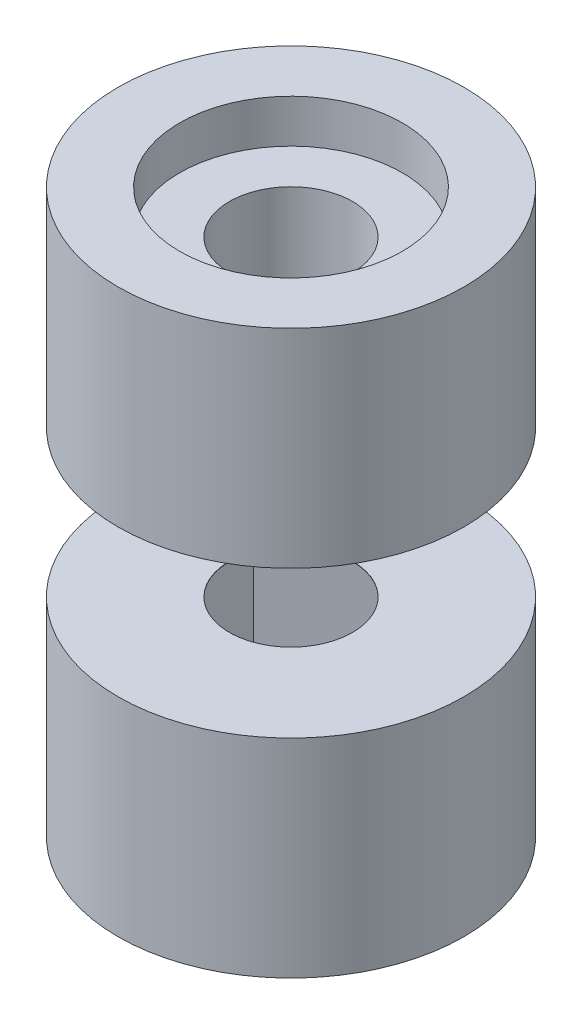
ISO-10303-21;
HEADER;
FILE_DESCRIPTION(('STEP AP214'),'2;1');
FILE_NAME('part.step','',(''),(''),'','','');
FILE_SCHEMA(('AUTOMOTIVE_DESIGN { 1 0 10303 214 1 1 1 1 }'));
ENDSEC;
DATA;
#1=APPLICATION_CONTEXT('core data for automotive mechanical design processes');
#2=APPLICATION_PROTOCOL_DEFINITION('international standard','automotive_design',2000,#1);
#3=PRODUCT_CONTEXT('',#1,'mechanical');
#4=PRODUCT('Part','Part','',(#3));
#5=PRODUCT_RELATED_PRODUCT_CATEGORY('part','',(#4));
#6=PRODUCT_DEFINITION_FORMATION('','',#4);
#7=PRODUCT_DEFINITION_CONTEXT('part definition',#1,'design');
#8=PRODUCT_DEFINITION('design','',#6,#7);
#9=PRODUCT_DEFINITION_SHAPE('','',#8);
#10=(LENGTH_UNIT() NAMED_UNIT(*) SI_UNIT(.MILLI.,.METRE.));
#11=(NAMED_UNIT(*) PLANE_ANGLE_UNIT() SI_UNIT($,.RADIAN.));
#12=(NAMED_UNIT(*) SI_UNIT($,.STERADIAN.) SOLID_ANGLE_UNIT());
#13=UNCERTAINTY_MEASURE_WITH_UNIT(LENGTH_MEASURE(1.E-05),#10,'distance_accuracy_value','');
#14=(GEOMETRIC_REPRESENTATION_CONTEXT(3) GLOBAL_UNCERTAINTY_ASSIGNED_CONTEXT((#13)) GLOBAL_UNIT_ASSIGNED_CONTEXT((#10,
#11,#12)) REPRESENTATION_CONTEXT('',''));
#15=CARTESIAN_POINT('',(0.,0.,0.));
#16=DIRECTION('',(0.,0.,1.));
#17=DIRECTION('',(1.,0.,0.));
#18=AXIS2_PLACEMENT_3D('',#15,#16,#17);
#19=CARTESIAN_POINT('',(0.,26.03,0.));
#20=DIRECTION('',(0.,-1.,0.));
#21=DIRECTION('',(0.,0.,-1.));
#22=AXIS2_PLACEMENT_3D('',#19,#20,#21);
#23=CYLINDRICAL_SURFACE('',#22,2.85);
#24=CARTESIAN_POINT('',(0.,16.415,0.));
#25=DIRECTION('',(0.,1.,0.));
#26=DIRECTION('',(0.,0.,1.));
#27=AXIS2_PLACEMENT_3D('',#24,#25,#26);
#28=CIRCLE('',#27,2.85);
#29=CARTESIAN_POINT('',(0.,16.415,2.85));
#30=VERTEX_POINT('',#29);
#31=EDGE_CURVE('E62',#30,#30,#28,.F.);
#32=ORIENTED_EDGE('',*,*,#31,.T.);
#33=EDGE_LOOP('',(#32));
#34=FACE_BOUND('',#33,.T.);
#35=CARTESIAN_POINT('',(0.,24.03,0.));
#36=DIRECTION('',(0.,1.,0.));
#37=DIRECTION('',(0.,0.,1.));
#38=AXIS2_PLACEMENT_3D('',#35,#36,#37);
#39=CIRCLE('',#38,2.85);
#40=CARTESIAN_POINT('',(0.,24.03,2.85));
#41=VERTEX_POINT('',#40);
#42=EDGE_CURVE('E53',#41,#41,#39,.T.);
#43=ORIENTED_EDGE('',*,*,#42,.T.);
#44=EDGE_LOOP('',(#43));
#45=FACE_BOUND('',#44,.T.);
#46=ADVANCED_FACE('F49',(#34,#45),#23,.F.);
#47=CARTESIAN_POINT('',(0.,26.03,0.));
#48=DIRECTION('',(0.,-1.,0.));
#49=DIRECTION('',(0.,0.,-1.));
#50=AXIS2_PLACEMENT_3D('',#47,#48,#49);
#51=CYLINDRICAL_SURFACE('',#50,8.);
#52=CARTESIAN_POINT('',(0.,26.03,0.));
#53=DIRECTION('',(0.,1.,0.));
#54=DIRECTION('',(0.,0.,1.));
#55=AXIS2_PLACEMENT_3D('',#52,#53,#54);
#56=CIRCLE('',#55,8.);
#57=CARTESIAN_POINT('',(0.,26.03,8.));
#58=VERTEX_POINT('',#57);
#59=EDGE_CURVE('E11',#58,#58,#56,.T.);
#60=ORIENTED_EDGE('',*,*,#59,.F.);
#61=EDGE_LOOP('',(#60));
#62=FACE_BOUND('',#61,.T.);
#63=CARTESIAN_POINT('',(0.,16.415,0.));
#64=DIRECTION('',(0.,1.,0.));
#65=DIRECTION('',(0.,0.,1.));
#66=AXIS2_PLACEMENT_3D('',#63,#64,#65);
#67=CIRCLE('',#66,8.);
#68=CARTESIAN_POINT('',(0.,16.415,8.));
#69=VERTEX_POINT('',#68);
#70=EDGE_CURVE('E57',#69,#69,#67,.T.);
#71=ORIENTED_EDGE('',*,*,#70,.T.);
#72=EDGE_LOOP('',(#71));
#73=FACE_BOUND('',#72,.T.);
#74=ADVANCED_FACE('F51',(#62,#73),#51,.T.);
#75=CARTESIAN_POINT('',(0.,26.03,0.));
#76=DIRECTION('',(0.,1.,0.));
#77=DIRECTION('',(0.,0.,1.));
#78=AXIS2_PLACEMENT_3D('',#75,#76,#77);
#79=PLANE('',#78);
#80=CARTESIAN_POINT('',(0.,26.03,0.));
#81=DIRECTION('',(0.,1.,0.));
#82=DIRECTION('',(0.,0.,1.));
#83=AXIS2_PLACEMENT_3D('',#80,#81,#82);
#84=CIRCLE('',#83,5.15);
#85=CARTESIAN_POINT('',(0.,26.03,5.15));
#86=VERTEX_POINT('',#85);
#87=EDGE_CURVE('E73',#86,#86,#84,.T.);
#88=ORIENTED_EDGE('',*,*,#87,.F.);
#89=EDGE_LOOP('',(#88));
#90=FACE_BOUND('',#89,.T.);
#91=ORIENTED_EDGE('',*,*,#59,.T.);
#92=EDGE_LOOP('',(#91));
#93=FACE_BOUND('',#92,.T.);
#94=ADVANCED_FACE('F82',(#90,#93),#79,.T.);
#95=CARTESIAN_POINT('',(10.2,16.415,-8.));
#96=DIRECTION('',(0.,1.,0.));
#97=DIRECTION('',(0.,0.,1.));
#98=AXIS2_PLACEMENT_3D('',#95,#96,#97);
#99=PLANE('',#98);
#100=ORIENTED_EDGE('',*,*,#31,.F.);
#101=EDGE_LOOP('',(#100));
#102=FACE_BOUND('',#101,.T.);
#103=ORIENTED_EDGE('',*,*,#70,.F.);
#104=EDGE_LOOP('',(#103));
#105=FACE_BOUND('',#104,.T.);
#106=ADVANCED_FACE('F84',(#102,#105),#99,.F.);
#107=CARTESIAN_POINT('',(0.,24.03,0.));
#108=DIRECTION('',(0.,1.,0.));
#109=DIRECTION('',(0.,0.,1.));
#110=AXIS2_PLACEMENT_3D('',#107,#108,#109);
#111=CYLINDRICAL_SURFACE('',#110,5.15);
#112=CARTESIAN_POINT('',(0.,24.03,0.));
#113=DIRECTION('',(0.,1.,0.));
#114=DIRECTION('',(0.,0.,1.));
#115=AXIS2_PLACEMENT_3D('',#112,#113,#114);
#116=CIRCLE('',#115,5.15);
#117=CARTESIAN_POINT('',(0.,24.03,5.15));
#118=VERTEX_POINT('',#117);
#119=EDGE_CURVE('E69',#118,#118,#116,.T.);
#120=ORIENTED_EDGE('',*,*,#119,.F.);
#121=EDGE_LOOP('',(#120));
#122=FACE_BOUND('',#121,.T.);
#123=ORIENTED_EDGE('',*,*,#87,.T.);
#124=EDGE_LOOP('',(#123));
#125=FACE_BOUND('',#124,.T.);
#126=ADVANCED_FACE('F80',(#122,#125),#111,.F.);
#127=CARTESIAN_POINT('',(0.,24.03,0.));
#128=DIRECTION('',(0.,1.,0.));
#129=DIRECTION('',(0.,0.,1.));
#130=AXIS2_PLACEMENT_3D('',#127,#128,#129);
#131=PLANE('',#130);
#132=ORIENTED_EDGE('',*,*,#42,.F.);
#133=EDGE_LOOP('',(#132));
#134=FACE_BOUND('',#133,.T.);
#135=ORIENTED_EDGE('',*,*,#119,.T.);
#136=EDGE_LOOP('',(#135));
#137=FACE_BOUND('',#136,.T.);
#138=ADVANCED_FACE('F99',(#134,#137),#131,.T.);
#139=CLOSED_SHELL('',(#46,#74,#94,#106,#126,#138));
#140=MANIFOLD_SOLID_BREP('B2',#139);
#141=CARTESIAN_POINT('',(0.,0.,0.));
#142=DIRECTION('',(0.,1.,0.));
#143=DIRECTION('',(0.,0.,1.));
#144=AXIS2_PLACEMENT_3D('',#141,#142,#143);
#145=PLANE('',#144);
#146=CARTESIAN_POINT('',(0.,0.,0.));
#147=DIRECTION('',(0.,1.,0.));
#148=DIRECTION('',(0.,0.,1.));
#149=AXIS2_PLACEMENT_3D('',#146,#147,#148);
#150=CIRCLE('',#149,8.);
#151=CARTESIAN_POINT('',(0.,0.,8.));
#152=VERTEX_POINT('',#151);
#153=EDGE_CURVE('E150',#152,#152,#150,.T.);
#154=ORIENTED_EDGE('',*,*,#153,.F.);
#155=EDGE_LOOP('',(#154));
#156=FACE_BOUND('',#155,.T.);
#157=DIRECTION('',(0.,0.,-1.));
#158=VECTOR('',#157,1.);
#159=CARTESIAN_POINT('',(4.1,0.,-2.36713610367746));
#160=LINE('',#159,#158);
#161=CARTESIAN_POINT('',(4.1,0.,2.36713610367747));
#162=VERTEX_POINT('',#161);
#163=CARTESIAN_POINT('',(4.1,0.,-2.36713610367746));
#164=VERTEX_POINT('',#163);
#165=EDGE_CURVE('E158',#162,#164,#160,.T.);
#166=ORIENTED_EDGE('',*,*,#165,.T.);
#167=DIRECTION('',(-0.866025403784439,0.,-0.5));
#168=VECTOR('',#167,1.);
#169=CARTESIAN_POINT('',(0.,0.,-4.73427220735493));
#170=LINE('',#169,#168);
#171=CARTESIAN_POINT('',(0.,0.,-4.73427220735493));
#172=VERTEX_POINT('',#171);
#173=EDGE_CURVE('E229',#164,#172,#170,.T.);
#174=ORIENTED_EDGE('',*,*,#173,.T.);
#175=DIRECTION('',(-0.866025403784438,0.,0.5));
#176=VECTOR('',#175,1.);
#177=CARTESIAN_POINT('',(-4.1,0.,-2.36713610367746));
#178=LINE('',#177,#176);
#179=CARTESIAN_POINT('',(-4.1,0.,-2.36713610367746));
#180=VERTEX_POINT('',#179);
#181=EDGE_CURVE('E232',#172,#180,#178,.T.);
#182=ORIENTED_EDGE('',*,*,#181,.T.);
#183=DIRECTION('',(0.,0.,1.));
#184=VECTOR('',#183,1.);
#185=CARTESIAN_POINT('',(-4.1,0.,2.36713610367747));
#186=LINE('',#185,#184);
#187=CARTESIAN_POINT('',(-4.1,0.,2.36713610367747));
#188=VERTEX_POINT('',#187);
#189=EDGE_CURVE('E235',#180,#188,#186,.T.);
#190=ORIENTED_EDGE('',*,*,#189,.T.);
#191=DIRECTION('',(0.866025403784439,0.,0.5));
#192=VECTOR('',#191,1.);
#193=CARTESIAN_POINT('',(0.,0.,4.73427220735493));
#194=LINE('',#193,#192);
#195=CARTESIAN_POINT('',(0.,0.,4.73427220735493));
#196=VERTEX_POINT('',#195);
#197=EDGE_CURVE('E219',#188,#196,#194,.T.);
#198=ORIENTED_EDGE('',*,*,#197,.T.);
#199=DIRECTION('',(0.866025403784439,0.,-0.5));
#200=VECTOR('',#199,1.);
#201=CARTESIAN_POINT('',(4.1,0.,2.36713610367747));
#202=LINE('',#201,#200);
#203=EDGE_CURVE('E238',#196,#162,#202,.T.);
#204=ORIENTED_EDGE('',*,*,#203,.T.);
#205=EDGE_LOOP('',(#166,#174,#182,#190,#198,#204));
#206=FACE_BOUND('',#205,.T.);
#207=ADVANCED_FACE('F141',(#156,#206),#145,.F.);
#208=CARTESIAN_POINT('',(0.,26.03,0.));
#209=DIRECTION('',(0.,-1.,0.));
#210=DIRECTION('',(0.,0.,-1.));
#211=AXIS2_PLACEMENT_3D('',#208,#209,#210);
#212=CYLINDRICAL_SURFACE('',#211,2.85);
#213=CARTESIAN_POINT('',(0.,9.615,0.));
#214=DIRECTION('',(0.,-1.,0.));
#215=DIRECTION('',(0.,0.,-1.));
#216=AXIS2_PLACEMENT_3D('',#213,#214,#215);
#217=CIRCLE('',#216,2.85);
#218=CARTESIAN_POINT('',(0.,9.615,-2.85));
#219=VERTEX_POINT('',#218);
#220=EDGE_CURVE('E250',#219,#219,#217,.F.);
#221=ORIENTED_EDGE('',*,*,#220,.T.);
#222=EDGE_LOOP('',(#221));
#223=FACE_BOUND('',#222,.T.);
#224=CARTESIAN_POINT('',(0.,9.6,0.));
#225=DIRECTION('',(0.,-1.,0.));
#226=DIRECTION('',(0.,0.,-1.));
#227=AXIS2_PLACEMENT_3D('',#224,#225,#226);
#228=CIRCLE('',#227,2.85);
#229=CARTESIAN_POINT('',(0.,9.6,-2.85));
#230=VERTEX_POINT('',#229);
#231=EDGE_CURVE('E145',#230,#230,#228,.T.);
#232=ORIENTED_EDGE('',*,*,#231,.T.);
#233=EDGE_LOOP('',(#232));
#234=FACE_BOUND('',#233,.T.);
#235=ADVANCED_FACE('F257',(#223,#234),#212,.F.);
#236=CARTESIAN_POINT('',(0.,26.03,0.));
#237=DIRECTION('',(0.,-1.,0.));
#238=DIRECTION('',(0.,0.,-1.));
#239=AXIS2_PLACEMENT_3D('',#236,#237,#238);
#240=CYLINDRICAL_SURFACE('',#239,8.);
#241=CARTESIAN_POINT('',(0.,9.615,0.));
#242=DIRECTION('',(0.,-1.,0.));
#243=DIRECTION('',(0.,0.,-1.));
#244=AXIS2_PLACEMENT_3D('',#241,#242,#243);
#245=CIRCLE('',#244,8.);
#246=CARTESIAN_POINT('',(0.,9.615,-8.));
#247=VERTEX_POINT('',#246);
#248=EDGE_CURVE('E47',#247,#247,#245,.T.);
#249=ORIENTED_EDGE('',*,*,#248,.T.);
#250=EDGE_LOOP('',(#249));
#251=FACE_BOUND('',#250,.T.);
#252=ORIENTED_EDGE('',*,*,#153,.T.);
#253=EDGE_LOOP('',(#252));
#254=FACE_BOUND('',#253,.T.);
#255=ADVANCED_FACE('F143',(#251,#254),#240,.T.);
#256=CARTESIAN_POINT('',(-10.2,9.615,-8.));
#257=DIRECTION('',(0.,-1.,0.));
#258=DIRECTION('',(0.,0.,-1.));
#259=AXIS2_PLACEMENT_3D('',#256,#257,#258);
#260=PLANE('',#259);
#261=ORIENTED_EDGE('',*,*,#220,.F.);
#262=EDGE_LOOP('',(#261));
#263=FACE_BOUND('',#262,.T.);
#264=ORIENTED_EDGE('',*,*,#248,.F.);
#265=EDGE_LOOP('',(#264));
#266=FACE_BOUND('',#265,.T.);
#267=ADVANCED_FACE('F276',(#263,#266),#260,.F.);
#268=CARTESIAN_POINT('',(4.1,9.6,-2.36713610367746));
#269=DIRECTION('',(-1.,0.,0.));
#270=DIRECTION('',(0.,0.,1.));
#271=AXIS2_PLACEMENT_3D('',#268,#269,#270);
#272=PLANE('',#271);
#273=ORIENTED_EDGE('',*,*,#165,.F.);
#274=DIRECTION('',(0.,-1.,0.));
#275=VECTOR('',#274,1.);
#276=CARTESIAN_POINT('',(4.1,9.6,2.36713610367747));
#277=LINE('',#276,#275);
#278=CARTESIAN_POINT('',(4.1,9.6,2.36713610367747));
#279=VERTEX_POINT('',#278);
#280=EDGE_CURVE('E224',#279,#162,#277,.T.);
#281=ORIENTED_EDGE('',*,*,#280,.F.);
#282=DIRECTION('',(0.,0.,-1.));
#283=VECTOR('',#282,1.);
#284=CARTESIAN_POINT('',(4.1,9.6,-2.36713610367746));
#285=LINE('',#284,#283);
#286=CARTESIAN_POINT('',(4.1,9.6,-2.36713610367746));
#287=VERTEX_POINT('',#286);
#288=EDGE_CURVE('E241',#279,#287,#285,.T.);
#289=ORIENTED_EDGE('',*,*,#288,.T.);
#290=DIRECTION('',(0.,-1.,0.));
#291=VECTOR('',#290,1.);
#292=CARTESIAN_POINT('',(4.1,9.6,-2.36713610367746));
#293=LINE('',#292,#291);
#294=EDGE_CURVE('E247',#287,#164,#293,.T.);
#295=ORIENTED_EDGE('',*,*,#294,.T.);
#296=EDGE_LOOP('',(#273,#281,#289,#295));
#297=FACE_BOUND('',#296,.T.);
#298=ADVANCED_FACE('F277',(#297),#272,.T.);
#299=CARTESIAN_POINT('',(0.,9.6,-4.73427220735493));
#300=DIRECTION('',(-0.5,0.,0.866025403784439));
#301=DIRECTION('',(0.866025403784439,0.,0.5));
#302=AXIS2_PLACEMENT_3D('',#299,#300,#301);
#303=PLANE('',#302);
#304=ORIENTED_EDGE('',*,*,#173,.F.);
#305=ORIENTED_EDGE('',*,*,#294,.F.);
#306=DIRECTION('',(-0.866025403784439,0.,-0.5));
#307=VECTOR('',#306,1.);
#308=CARTESIAN_POINT('',(0.,9.6,-4.73427220735493));
#309=LINE('',#308,#307);
#310=CARTESIAN_POINT('',(0.,9.6,-4.73427220735493));
#311=VERTEX_POINT('',#310);
#312=EDGE_CURVE('E197',#287,#311,#309,.T.);
#313=ORIENTED_EDGE('',*,*,#312,.T.);
#314=DIRECTION('',(0.,-1.,0.));
#315=VECTOR('',#314,1.);
#316=CARTESIAN_POINT('',(0.,9.6,-4.73427220735493));
#317=LINE('',#316,#315);
#318=EDGE_CURVE('E245',#311,#172,#317,.T.);
#319=ORIENTED_EDGE('',*,*,#318,.T.);
#320=EDGE_LOOP('',(#304,#305,#313,#319));
#321=FACE_BOUND('',#320,.T.);
#322=ADVANCED_FACE('F282',(#321),#303,.T.);
#323=CARTESIAN_POINT('',(-4.1,9.6,-2.36713610367746));
#324=DIRECTION('',(0.5,0.,0.866025403784438));
#325=DIRECTION('',(0.866025403784439,0.,-0.5));
#326=AXIS2_PLACEMENT_3D('',#323,#324,#325);
#327=PLANE('',#326);
#328=ORIENTED_EDGE('',*,*,#181,.F.);
#329=ORIENTED_EDGE('',*,*,#318,.F.);
#330=DIRECTION('',(-0.866025403784438,0.,0.5));
#331=VECTOR('',#330,1.);
#332=CARTESIAN_POINT('',(-4.1,9.6,-2.36713610367746));
#333=LINE('',#332,#331);
#334=CARTESIAN_POINT('',(-4.1,9.6,-2.36713610367746));
#335=VERTEX_POINT('',#334);
#336=EDGE_CURVE('E215',#311,#335,#333,.T.);
#337=ORIENTED_EDGE('',*,*,#336,.T.);
#338=DIRECTION('',(0.,-1.,0.));
#339=VECTOR('',#338,1.);
#340=CARTESIAN_POINT('',(-4.1,9.6,-2.36713610367746));
#341=LINE('',#340,#339);
#342=EDGE_CURVE('E212',#335,#180,#341,.T.);
#343=ORIENTED_EDGE('',*,*,#342,.T.);
#344=EDGE_LOOP('',(#328,#329,#337,#343));
#345=FACE_BOUND('',#344,.T.);
#346=ADVANCED_FACE('F285',(#345),#327,.T.);
#347=CARTESIAN_POINT('',(-4.1,9.6,2.36713610367747));
#348=DIRECTION('',(1.,0.,0.));
#349=DIRECTION('',(0.,0.,-1.));
#350=AXIS2_PLACEMENT_3D('',#347,#348,#349);
#351=PLANE('',#350);
#352=ORIENTED_EDGE('',*,*,#189,.F.);
#353=ORIENTED_EDGE('',*,*,#342,.F.);
#354=DIRECTION('',(0.,0.,1.));
#355=VECTOR('',#354,1.);
#356=CARTESIAN_POINT('',(-4.1,9.6,2.36713610367747));
#357=LINE('',#356,#355);
#358=CARTESIAN_POINT('',(-4.1,9.6,2.36713610367747));
#359=VERTEX_POINT('',#358);
#360=EDGE_CURVE('E207',#335,#359,#357,.T.);
#361=ORIENTED_EDGE('',*,*,#360,.T.);
#362=DIRECTION('',(0.,-1.,0.));
#363=VECTOR('',#362,1.);
#364=CARTESIAN_POINT('',(-4.1,9.6,2.36713610367747));
#365=LINE('',#364,#363);
#366=EDGE_CURVE('E211',#359,#188,#365,.T.);
#367=ORIENTED_EDGE('',*,*,#366,.T.);
#368=EDGE_LOOP('',(#352,#353,#361,#367));
#369=FACE_BOUND('',#368,.T.);
#370=ADVANCED_FACE('F210',(#369),#351,.T.);
#371=CARTESIAN_POINT('',(0.,9.6,4.73427220735493));
#372=DIRECTION('',(0.5,0.,-0.866025403784439));
#373=DIRECTION('',(-0.866025403784439,0.,-0.5));
#374=AXIS2_PLACEMENT_3D('',#371,#372,#373);
#375=PLANE('',#374);
#376=ORIENTED_EDGE('',*,*,#197,.F.);
#377=ORIENTED_EDGE('',*,*,#366,.F.);
#378=DIRECTION('',(0.866025403784439,0.,0.5));
#379=VECTOR('',#378,1.);
#380=CARTESIAN_POINT('',(0.,9.6,4.73427220735493));
#381=LINE('',#380,#379);
#382=CARTESIAN_POINT('',(0.,9.6,4.73427220735493));
#383=VERTEX_POINT('',#382);
#384=EDGE_CURVE('E214',#359,#383,#381,.T.);
#385=ORIENTED_EDGE('',*,*,#384,.T.);
#386=DIRECTION('',(0.,-1.,0.));
#387=VECTOR('',#386,1.);
#388=CARTESIAN_POINT('',(0.,9.6,4.73427220735493));
#389=LINE('',#388,#387);
#390=EDGE_CURVE('E188',#383,#196,#389,.T.);
#391=ORIENTED_EDGE('',*,*,#390,.T.);
#392=EDGE_LOOP('',(#376,#377,#385,#391));
#393=FACE_BOUND('',#392,.T.);
#394=ADVANCED_FACE('F217',(#393),#375,.T.);
#395=CARTESIAN_POINT('',(4.1,9.6,2.36713610367747));
#396=DIRECTION('',(-0.5,0.,-0.866025403784439));
#397=DIRECTION('',(-0.866025403784439,0.,0.5));
#398=AXIS2_PLACEMENT_3D('',#395,#396,#397);
#399=PLANE('',#398);
#400=ORIENTED_EDGE('',*,*,#203,.F.);
#401=ORIENTED_EDGE('',*,*,#390,.F.);
#402=DIRECTION('',(0.866025403784439,0.,-0.5));
#403=VECTOR('',#402,1.);
#404=CARTESIAN_POINT('',(4.1,9.6,2.36713610367747));
#405=LINE('',#404,#403);
#406=EDGE_CURVE('E166',#383,#279,#405,.T.);
#407=ORIENTED_EDGE('',*,*,#406,.T.);
#408=ORIENTED_EDGE('',*,*,#280,.T.);
#409=EDGE_LOOP('',(#400,#401,#407,#408));
#410=FACE_BOUND('',#409,.T.);
#411=ADVANCED_FACE('F260',(#410),#399,.T.);
#412=CARTESIAN_POINT('',(0.,9.6,0.));
#413=DIRECTION('',(0.,-1.,0.));
#414=DIRECTION('',(0.,0.,-1.));
#415=AXIS2_PLACEMENT_3D('',#412,#413,#414);
#416=PLANE('',#415);
#417=ORIENTED_EDGE('',*,*,#231,.F.);
#418=EDGE_LOOP('',(#417));
#419=FACE_BOUND('',#418,.T.);
#420=ORIENTED_EDGE('',*,*,#288,.F.);
#421=ORIENTED_EDGE('',*,*,#406,.F.);
#422=ORIENTED_EDGE('',*,*,#384,.F.);
#423=ORIENTED_EDGE('',*,*,#360,.F.);
#424=ORIENTED_EDGE('',*,*,#336,.F.);
#425=ORIENTED_EDGE('',*,*,#312,.F.);
#426=EDGE_LOOP('',(#420,#421,#422,#423,#424,#425));
#427=FACE_BOUND('',#426,.T.);
#428=ADVANCED_FACE('F222',(#419,#427),#416,.T.);
#429=CLOSED_SHELL('',(#207,#235,#255,#267,#298,#322,#346,#370,#394,#411,#428));
#430=MANIFOLD_SOLID_BREP('B6',#429);
#431=ADVANCED_BREP_SHAPE_REPRESENTATION('',(#18,#140,#430),#14);
#432=SHAPE_DEFINITION_REPRESENTATION(#9,#431);
ENDSEC;
END-ISO-10303-21;
